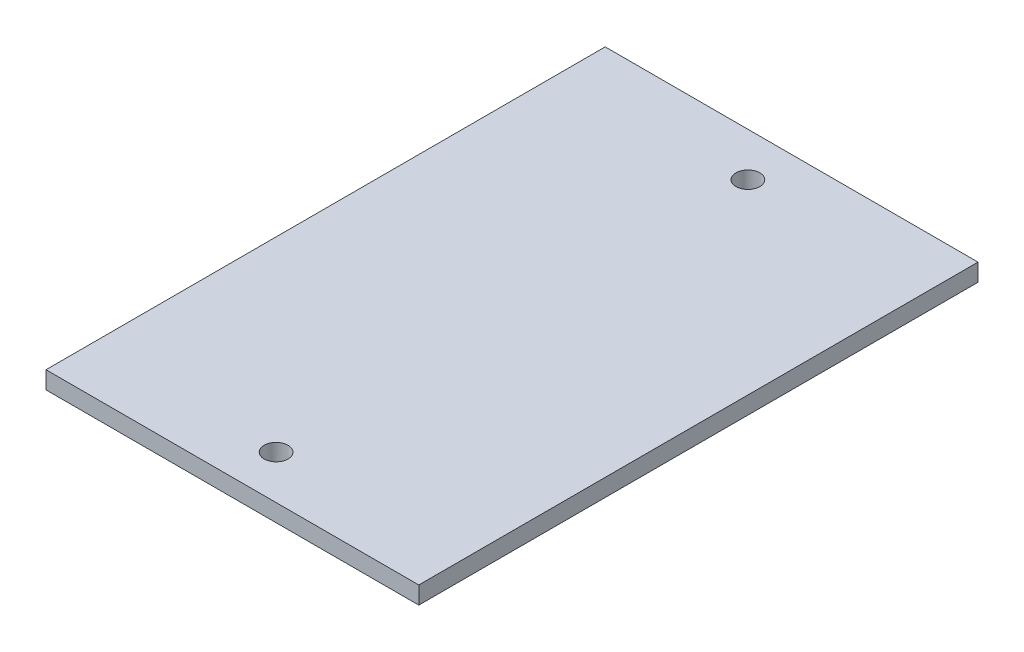
ISO-10303-21;
HEADER;
FILE_DESCRIPTION(('STEP AP214'),'2;1');
FILE_NAME('part.step','',(''),(''),'','','');
FILE_SCHEMA(('AUTOMOTIVE_DESIGN { 1 0 10303 214 1 1 1 1 }'));
ENDSEC;
DATA;
#1=APPLICATION_CONTEXT('core data for automotive mechanical design processes');
#2=APPLICATION_PROTOCOL_DEFINITION('international standard','automotive_design',2000,#1);
#3=PRODUCT_CONTEXT('',#1,'mechanical');
#4=PRODUCT('Part','Part','',(#3));
#5=PRODUCT_RELATED_PRODUCT_CATEGORY('part','',(#4));
#6=PRODUCT_DEFINITION_FORMATION('','',#4);
#7=PRODUCT_DEFINITION_CONTEXT('part definition',#1,'design');
#8=PRODUCT_DEFINITION('design','',#6,#7);
#9=PRODUCT_DEFINITION_SHAPE('','',#8);
#10=(LENGTH_UNIT() NAMED_UNIT(*) SI_UNIT(.MILLI.,.METRE.));
#11=(NAMED_UNIT(*) PLANE_ANGLE_UNIT() SI_UNIT($,.RADIAN.));
#12=(NAMED_UNIT(*) SI_UNIT($,.STERADIAN.) SOLID_ANGLE_UNIT());
#13=UNCERTAINTY_MEASURE_WITH_UNIT(LENGTH_MEASURE(1.E-05),#10,'distance_accuracy_value','');
#14=(GEOMETRIC_REPRESENTATION_CONTEXT(3) GLOBAL_UNCERTAINTY_ASSIGNED_CONTEXT((#13)) GLOBAL_UNIT_ASSIGNED_CONTEXT((#10,
#11,#12)) REPRESENTATION_CONTEXT('',''));
#15=CARTESIAN_POINT('',(0.,0.,0.));
#16=DIRECTION('',(0.,0.,1.));
#17=DIRECTION('',(1.,0.,0.));
#18=AXIS2_PLACEMENT_3D('',#15,#16,#17);
#19=CARTESIAN_POINT('',(0.,3.,0.));
#20=DIRECTION('',(0.,1.,0.));
#21=DIRECTION('',(0.,0.,1.));
#22=AXIS2_PLACEMENT_3D('',#19,#20,#21);
#23=PLANE('',#22);
#24=CARTESIAN_POINT('',(32.,3.,7.5));
#25=DIRECTION('',(0.,1.,0.));
#26=DIRECTION('',(0.,0.,1.));
#27=AXIS2_PLACEMENT_3D('',#24,#25,#26);
#28=CIRCLE('',#27,2.05);
#29=CARTESIAN_POINT('',(32.,3.,9.55));
#30=VERTEX_POINT('',#29);
#31=EDGE_CURVE('E104',#30,#30,#28,.T.);
#32=ORIENTED_EDGE('',*,*,#31,.F.);
#33=EDGE_LOOP('',(#32));
#34=FACE_BOUND('',#33,.T.);
#35=DIRECTION('',(0.,0.,1.));
#36=VECTOR('',#35,1.);
#37=CARTESIAN_POINT('',(0.,3.,0.));
#38=LINE('',#37,#36);
#39=CARTESIAN_POINT('',(0.,3.,0.));
#40=VERTEX_POINT('',#39);
#41=CARTESIAN_POINT('',(0.,3.,96.));
#42=VERTEX_POINT('',#41);
#43=EDGE_CURVE('E89',#40,#42,#38,.T.);
#44=ORIENTED_EDGE('',*,*,#43,.T.);
#45=DIRECTION('',(1.,0.,0.));
#46=VECTOR('',#45,1.);
#47=CARTESIAN_POINT('',(0.,3.,96.));
#48=LINE('',#47,#46);
#49=CARTESIAN_POINT('',(64.,3.,96.));
#50=VERTEX_POINT('',#49);
#51=EDGE_CURVE('E84',#42,#50,#48,.T.);
#52=ORIENTED_EDGE('',*,*,#51,.T.);
#53=DIRECTION('',(0.,0.,-1.));
#54=VECTOR('',#53,1.);
#55=CARTESIAN_POINT('',(64.,3.,0.));
#56=LINE('',#55,#54);
#57=CARTESIAN_POINT('',(64.,3.,0.));
#58=VERTEX_POINT('',#57);
#59=EDGE_CURVE('E87',#50,#58,#56,.T.);
#60=ORIENTED_EDGE('',*,*,#59,.T.);
#61=DIRECTION('',(-1.,0.,0.));
#62=VECTOR('',#61,1.);
#63=CARTESIAN_POINT('',(0.,3.,0.));
#64=LINE('',#63,#62);
#65=EDGE_CURVE('E54',#58,#40,#64,.T.);
#66=ORIENTED_EDGE('',*,*,#65,.T.);
#67=EDGE_LOOP('',(#44,#52,#60,#66));
#68=FACE_BOUND('',#67,.T.);
#69=CARTESIAN_POINT('',(32.,3.,88.5));
#70=DIRECTION('',(0.,1.,0.));
#71=DIRECTION('',(0.,0.,1.));
#72=AXIS2_PLACEMENT_3D('',#69,#70,#71);
#73=CIRCLE('',#72,2.04999999999999);
#74=CARTESIAN_POINT('',(32.,3.,90.55));
#75=VERTEX_POINT('',#74);
#76=EDGE_CURVE('E119',#75,#75,#73,.T.);
#77=ORIENTED_EDGE('',*,*,#76,.F.);
#78=EDGE_LOOP('',(#77));
#79=FACE_BOUND('',#78,.T.);
#80=ADVANCED_FACE('F37',(#34,#68,#79),#23,.T.);
#81=CARTESIAN_POINT('',(0.,0.,0.));
#82=DIRECTION('',(0.,1.,0.));
#83=DIRECTION('',(0.,0.,1.));
#84=AXIS2_PLACEMENT_3D('',#81,#82,#83);
#85=PLANE('',#84);
#86=DIRECTION('',(0.,0.,1.));
#87=VECTOR('',#86,1.);
#88=CARTESIAN_POINT('',(0.,0.,0.));
#89=LINE('',#88,#87);
#90=CARTESIAN_POINT('',(0.,0.,0.));
#91=VERTEX_POINT('',#90);
#92=CARTESIAN_POINT('',(0.,0.,96.));
#93=VERTEX_POINT('',#92);
#94=EDGE_CURVE('E101',#91,#93,#89,.T.);
#95=ORIENTED_EDGE('',*,*,#94,.F.);
#96=DIRECTION('',(-1.,0.,0.));
#97=VECTOR('',#96,1.);
#98=CARTESIAN_POINT('',(0.,0.,0.));
#99=LINE('',#98,#97);
#100=CARTESIAN_POINT('',(64.,0.,0.));
#101=VERTEX_POINT('',#100);
#102=EDGE_CURVE('E77',#101,#91,#99,.T.);
#103=ORIENTED_EDGE('',*,*,#102,.F.);
#104=DIRECTION('',(0.,0.,-1.));
#105=VECTOR('',#104,1.);
#106=CARTESIAN_POINT('',(64.,0.,0.));
#107=LINE('',#106,#105);
#108=CARTESIAN_POINT('',(64.,0.,96.));
#109=VERTEX_POINT('',#108);
#110=EDGE_CURVE('E71',#109,#101,#107,.T.);
#111=ORIENTED_EDGE('',*,*,#110,.F.);
#112=DIRECTION('',(1.,0.,0.));
#113=VECTOR('',#112,1.);
#114=CARTESIAN_POINT('',(0.,0.,96.));
#115=LINE('',#114,#113);
#116=EDGE_CURVE('E93',#93,#109,#115,.T.);
#117=ORIENTED_EDGE('',*,*,#116,.F.);
#118=EDGE_LOOP('',(#95,#103,#111,#117));
#119=FACE_BOUND('',#118,.T.);
#120=CARTESIAN_POINT('',(32.,0.,7.5));
#121=DIRECTION('',(0.,1.,0.));
#122=DIRECTION('',(0.,0.,1.));
#123=AXIS2_PLACEMENT_3D('',#120,#121,#122);
#124=CIRCLE('',#123,2.05);
#125=CARTESIAN_POINT('',(32.,0.,9.55));
#126=VERTEX_POINT('',#125);
#127=EDGE_CURVE('E116',#126,#126,#124,.T.);
#128=ORIENTED_EDGE('',*,*,#127,.T.);
#129=EDGE_LOOP('',(#128));
#130=FACE_BOUND('',#129,.T.);
#131=CARTESIAN_POINT('',(32.,0.,88.5));
#132=DIRECTION('',(0.,1.,0.));
#133=DIRECTION('',(0.,0.,1.));
#134=AXIS2_PLACEMENT_3D('',#131,#132,#133);
#135=CIRCLE('',#134,2.04999999999999);
#136=CARTESIAN_POINT('',(32.,0.,90.55));
#137=VERTEX_POINT('',#136);
#138=EDGE_CURVE('E122',#137,#137,#135,.T.);
#139=ORIENTED_EDGE('',*,*,#138,.T.);
#140=EDGE_LOOP('',(#139));
#141=FACE_BOUND('',#140,.T.);
#142=ADVANCED_FACE('F112',(#119,#130,#141),#85,.F.);
#143=CARTESIAN_POINT('',(0.,3.,0.));
#144=DIRECTION('',(1.,0.,0.));
#145=DIRECTION('',(0.,0.,-1.));
#146=AXIS2_PLACEMENT_3D('',#143,#144,#145);
#147=PLANE('',#146);
#148=ORIENTED_EDGE('',*,*,#94,.T.);
#149=DIRECTION('',(0.,-1.,0.));
#150=VECTOR('',#149,1.);
#151=CARTESIAN_POINT('',(0.,3.,96.));
#152=LINE('',#151,#150);
#153=EDGE_CURVE('E11',#42,#93,#152,.T.);
#154=ORIENTED_EDGE('',*,*,#153,.F.);
#155=ORIENTED_EDGE('',*,*,#43,.F.);
#156=DIRECTION('',(0.,-1.,0.));
#157=VECTOR('',#156,1.);
#158=CARTESIAN_POINT('',(0.,3.,0.));
#159=LINE('',#158,#157);
#160=EDGE_CURVE('E97',#40,#91,#159,.T.);
#161=ORIENTED_EDGE('',*,*,#160,.T.);
#162=EDGE_LOOP('',(#148,#154,#155,#161));
#163=FACE_BOUND('',#162,.T.);
#164=ADVANCED_FACE('F39',(#163),#147,.F.);
#165=CARTESIAN_POINT('',(0.,3.,96.));
#166=DIRECTION('',(0.,0.,-1.));
#167=DIRECTION('',(-1.,0.,0.));
#168=AXIS2_PLACEMENT_3D('',#165,#166,#167);
#169=PLANE('',#168);
#170=ORIENTED_EDGE('',*,*,#116,.T.);
#171=DIRECTION('',(0.,-1.,0.));
#172=VECTOR('',#171,1.);
#173=CARTESIAN_POINT('',(64.,3.,96.));
#174=LINE('',#173,#172);
#175=EDGE_CURVE('E46',#50,#109,#174,.T.);
#176=ORIENTED_EDGE('',*,*,#175,.F.);
#177=ORIENTED_EDGE('',*,*,#51,.F.);
#178=ORIENTED_EDGE('',*,*,#153,.T.);
#179=EDGE_LOOP('',(#170,#176,#177,#178));
#180=FACE_BOUND('',#179,.T.);
#181=ADVANCED_FACE('F92',(#180),#169,.F.);
#182=CARTESIAN_POINT('',(64.,3.,0.));
#183=DIRECTION('',(-1.,0.,0.));
#184=DIRECTION('',(0.,0.,1.));
#185=AXIS2_PLACEMENT_3D('',#182,#183,#184);
#186=PLANE('',#185);
#187=ORIENTED_EDGE('',*,*,#110,.T.);
#188=DIRECTION('',(0.,-1.,0.));
#189=VECTOR('',#188,1.);
#190=CARTESIAN_POINT('',(64.,3.,0.));
#191=LINE('',#190,#189);
#192=EDGE_CURVE('E94',#58,#101,#191,.T.);
#193=ORIENTED_EDGE('',*,*,#192,.F.);
#194=ORIENTED_EDGE('',*,*,#59,.F.);
#195=ORIENTED_EDGE('',*,*,#175,.T.);
#196=EDGE_LOOP('',(#187,#193,#194,#195));
#197=FACE_BOUND('',#196,.T.);
#198=ADVANCED_FACE('F95',(#197),#186,.F.);
#199=CARTESIAN_POINT('',(0.,3.,0.));
#200=DIRECTION('',(0.,0.,1.));
#201=DIRECTION('',(1.,0.,0.));
#202=AXIS2_PLACEMENT_3D('',#199,#200,#201);
#203=PLANE('',#202);
#204=ORIENTED_EDGE('',*,*,#102,.T.);
#205=ORIENTED_EDGE('',*,*,#160,.F.);
#206=ORIENTED_EDGE('',*,*,#65,.F.);
#207=ORIENTED_EDGE('',*,*,#192,.T.);
#208=EDGE_LOOP('',(#204,#205,#206,#207));
#209=FACE_BOUND('',#208,.T.);
#210=ADVANCED_FACE('F109',(#209),#203,.F.);
#211=CARTESIAN_POINT('',(32.,3.,7.5));
#212=DIRECTION('',(0.,-1.,0.));
#213=DIRECTION('',(0.,0.,-1.));
#214=AXIS2_PLACEMENT_3D('',#211,#212,#213);
#215=CYLINDRICAL_SURFACE('',#214,2.05);
#216=ORIENTED_EDGE('',*,*,#31,.T.);
#217=EDGE_LOOP('',(#216));
#218=FACE_BOUND('',#217,.T.);
#219=ORIENTED_EDGE('',*,*,#127,.F.);
#220=EDGE_LOOP('',(#219));
#221=FACE_BOUND('',#220,.T.);
#222=ADVANCED_FACE('F139',(#218,#221),#215,.F.);
#223=CARTESIAN_POINT('',(32.,3.,88.5));
#224=DIRECTION('',(0.,-1.,0.));
#225=DIRECTION('',(0.,0.,-1.));
#226=AXIS2_PLACEMENT_3D('',#223,#224,#225);
#227=CYLINDRICAL_SURFACE('',#226,2.04999999999999);
#228=ORIENTED_EDGE('',*,*,#76,.T.);
#229=EDGE_LOOP('',(#228));
#230=FACE_BOUND('',#229,.T.);
#231=ORIENTED_EDGE('',*,*,#138,.F.);
#232=EDGE_LOOP('',(#231));
#233=FACE_BOUND('',#232,.T.);
#234=ADVANCED_FACE('F128',(#230,#233),#227,.F.);
#235=CLOSED_SHELL('',(#80,#142,#164,#181,#198,#210,#222,#234));
#236=MANIFOLD_SOLID_BREP('B2',#235);
#237=ADVANCED_BREP_SHAPE_REPRESENTATION('',(#18,#236),#14);
#238=SHAPE_DEFINITION_REPRESENTATION(#9,#237);
ENDSEC;
END-ISO-10303-21;
